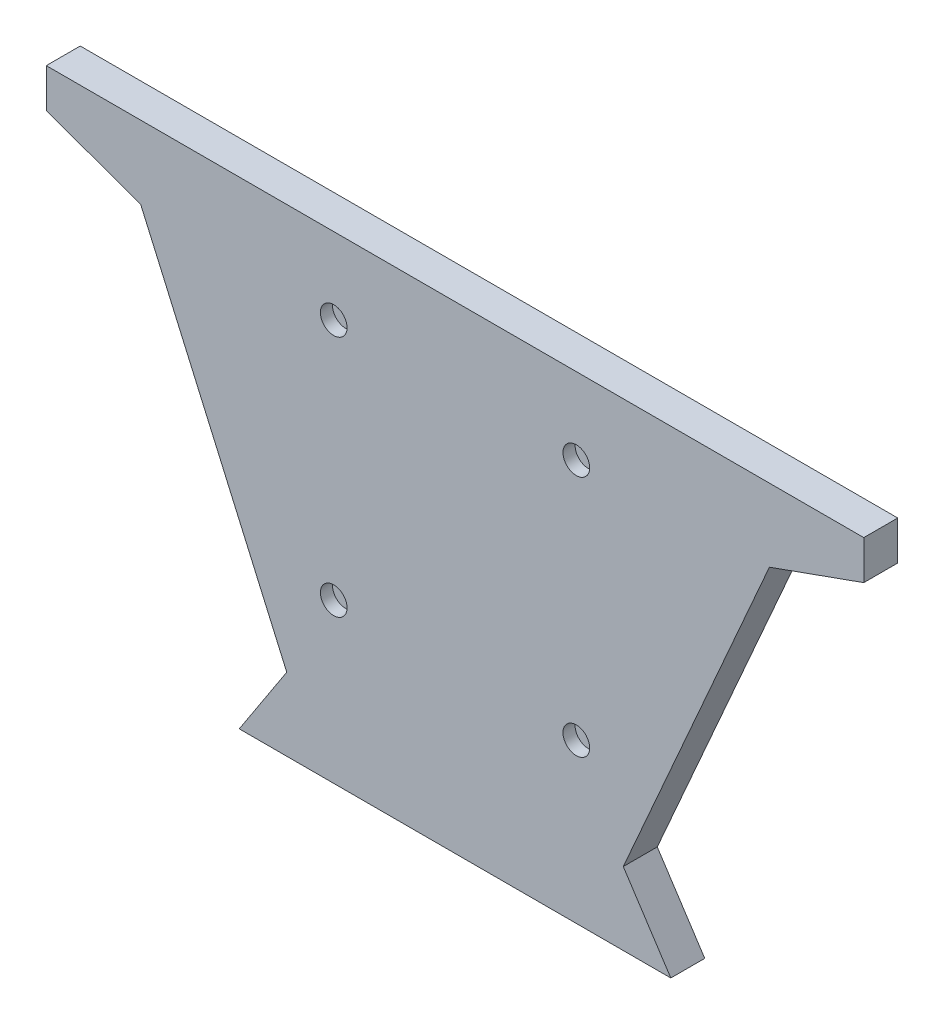
ISO-10303-21;
HEADER;
FILE_DESCRIPTION(('STEP AP214'),'2;1');
FILE_NAME('part.step','',(''),(''),'','','');
FILE_SCHEMA(('AUTOMOTIVE_DESIGN { 1 0 10303 214 1 1 1 1 }'));
ENDSEC;
DATA;
#1=APPLICATION_CONTEXT('core data for automotive mechanical design processes');
#2=APPLICATION_PROTOCOL_DEFINITION('international standard','automotive_design',2000,#1);
#3=PRODUCT_CONTEXT('',#1,'mechanical');
#4=PRODUCT('Part','Part','',(#3));
#5=PRODUCT_RELATED_PRODUCT_CATEGORY('part','',(#4));
#6=PRODUCT_DEFINITION_FORMATION('','',#4);
#7=PRODUCT_DEFINITION_CONTEXT('part definition',#1,'design');
#8=PRODUCT_DEFINITION('design','',#6,#7);
#9=PRODUCT_DEFINITION_SHAPE('','',#8);
#10=(LENGTH_UNIT() NAMED_UNIT(*) SI_UNIT(.MILLI.,.METRE.));
#11=(NAMED_UNIT(*) PLANE_ANGLE_UNIT() SI_UNIT($,.RADIAN.));
#12=(NAMED_UNIT(*) SI_UNIT($,.STERADIAN.) SOLID_ANGLE_UNIT());
#13=UNCERTAINTY_MEASURE_WITH_UNIT(LENGTH_MEASURE(1.E-05),#10,'distance_accuracy_value','');
#14=(GEOMETRIC_REPRESENTATION_CONTEXT(3) GLOBAL_UNCERTAINTY_ASSIGNED_CONTEXT((#13)) GLOBAL_UNIT_ASSIGNED_CONTEXT((#10,
#11,#12)) REPRESENTATION_CONTEXT('',''));
#15=CARTESIAN_POINT('',(0.,0.,0.));
#16=DIRECTION('',(0.,0.,1.));
#17=DIRECTION('',(1.,0.,0.));
#18=AXIS2_PLACEMENT_3D('',#15,#16,#17);
#19=CARTESIAN_POINT('',(0.,0.,7.));
#20=DIRECTION('',(0.,0.,1.));
#21=DIRECTION('',(1.,0.,0.));
#22=AXIS2_PLACEMENT_3D('',#19,#20,#21);
#23=PLANE('',#22);
#24=CARTESIAN_POINT('',(-24.9999999999995,-16.5530769247216,7.));
#25=DIRECTION('',(0.,0.,1.));
#26=DIRECTION('',(1.,0.,0.));
#27=AXIS2_PLACEMENT_3D('',#24,#25,#26);
#28=CIRCLE('',#27,2.75);
#29=CARTESIAN_POINT('',(-22.2499999999995,-16.5530769247216,7.));
#30=VERTEX_POINT('',#29);
#31=EDGE_CURVE('E271',#30,#30,#28,.T.);
#32=ORIENTED_EDGE('',*,*,#31,.F.);
#33=EDGE_LOOP('',(#32));
#34=FACE_BOUND('',#33,.T.);
#35=CARTESIAN_POINT('',(25.0000000000005,-16.5530769247213,7.));
#36=DIRECTION('',(0.,0.,1.));
#37=DIRECTION('',(1.,0.,0.));
#38=AXIS2_PLACEMENT_3D('',#35,#36,#37);
#39=CIRCLE('',#38,2.75);
#40=CARTESIAN_POINT('',(27.7500000000005,-16.5530769247213,7.));
#41=VERTEX_POINT('',#40);
#42=EDGE_CURVE('E280',#41,#41,#39,.T.);
#43=ORIENTED_EDGE('',*,*,#42,.F.);
#44=EDGE_LOOP('',(#43));
#45=FACE_BOUND('',#44,.T.);
#46=CARTESIAN_POINT('',(25.,33.4469230752787,7.));
#47=DIRECTION('',(0.,0.,1.));
#48=DIRECTION('',(1.,0.,0.));
#49=AXIS2_PLACEMENT_3D('',#46,#47,#48);
#50=CIRCLE('',#49,2.75);
#51=CARTESIAN_POINT('',(27.75,33.4469230752787,7.));
#52=VERTEX_POINT('',#51);
#53=EDGE_CURVE('E260',#52,#52,#50,.T.);
#54=ORIENTED_EDGE('',*,*,#53,.F.);
#55=EDGE_LOOP('',(#54));
#56=FACE_BOUND('',#55,.T.);
#57=CARTESIAN_POINT('',(-25.,33.4469230752784,7.));
#58=DIRECTION('',(0.,0.,1.));
#59=DIRECTION('',(1.,0.,0.));
#60=AXIS2_PLACEMENT_3D('',#57,#58,#59);
#61=CIRCLE('',#60,2.75);
#62=CARTESIAN_POINT('',(-22.25,33.4469230752784,7.));
#63=VERTEX_POINT('',#62);
#64=EDGE_CURVE('E254',#63,#63,#61,.T.);
#65=ORIENTED_EDGE('',*,*,#64,.F.);
#66=EDGE_LOOP('',(#65));
#67=FACE_BOUND('',#66,.T.);
#68=DIRECTION('',(0.402524691548119,-0.915409128583549,0.));
#69=VECTOR('',#68,1.);
#70=CARTESIAN_POINT('',(-41.6839180394226,-18.3292974992485,7.));
#71=LINE('',#70,#69);
#72=CARTESIAN_POINT('',(-64.8041435722949,34.25,7.));
#73=VERTEX_POINT('',#72);
#74=CARTESIAN_POINT('',(-34.6832495260328,-34.25,7.));
#75=VERTEX_POINT('',#74);
#76=EDGE_CURVE('E120',#73,#75,#71,.T.);
#77=ORIENTED_EDGE('',*,*,#76,.T.);
#78=DIRECTION('',(-0.54656898395897,-0.837414082622247,0.));
#79=VECTOR('',#78,1.);
#80=CARTESIAN_POINT('',(-8.64567559469956,5.64291695529728,7.));
#81=LINE('',#80,#79);
#82=CARTESIAN_POINT('',(-44.4735491275298,-49.25,7.));
#83=VERTEX_POINT('',#82);
#84=EDGE_CURVE('E113',#75,#83,#81,.T.);
#85=ORIENTED_EDGE('',*,*,#84,.T.);
#86=DIRECTION('',(1.,0.,0.));
#87=VECTOR('',#86,1.);
#88=CARTESIAN_POINT('',(-44.4735491275298,-49.25,7.));
#89=LINE('',#88,#87);
#90=CARTESIAN_POINT('',(44.4735491275299,-49.25,7.));
#91=VERTEX_POINT('',#90);
#92=EDGE_CURVE('E148',#83,#91,#89,.T.);
#93=ORIENTED_EDGE('',*,*,#92,.T.);
#94=DIRECTION('',(-0.54656898395897,0.837414082622247,0.));
#95=VECTOR('',#94,1.);
#96=CARTESIAN_POINT('',(8.64567559469958,5.64291695529731,7.));
#97=LINE('',#96,#95);
#98=CARTESIAN_POINT('',(34.6832495260329,-34.25,7.));
#99=VERTEX_POINT('',#98);
#100=EDGE_CURVE('E182',#91,#99,#97,.T.);
#101=ORIENTED_EDGE('',*,*,#100,.T.);
#102=DIRECTION('',(0.402524691548119,0.915409128583549,0.));
#103=VECTOR('',#102,1.);
#104=CARTESIAN_POINT('',(41.6839180394226,-18.3292974992485,7.));
#105=LINE('',#104,#103);
#106=CARTESIAN_POINT('',(64.804143572295,34.25,7.));
#107=VERTEX_POINT('',#106);
#108=EDGE_CURVE('E187',#99,#107,#105,.T.);
#109=ORIENTED_EDGE('',*,*,#108,.T.);
#110=DIRECTION('',(0.94153595264122,0.336912525567082,0.));
#111=VECTOR('',#110,1.);
#112=CARTESIAN_POINT('',(-3.50870093871182,9.805417816695,7.));
#113=LINE('',#112,#111);
#114=CARTESIAN_POINT('',(84.25,41.2083668924107,7.));
#115=VERTEX_POINT('',#114);
#116=EDGE_CURVE('E178',#107,#115,#113,.T.);
#117=ORIENTED_EDGE('',*,*,#116,.T.);
#118=DIRECTION('',(0.,1.,0.));
#119=VECTOR('',#118,1.);
#120=CARTESIAN_POINT('',(84.25,41.2083668924107,7.));
#121=LINE('',#120,#119);
#122=CARTESIAN_POINT('',(84.25,49.25,7.));
#123=VERTEX_POINT('',#122);
#124=EDGE_CURVE('E201',#115,#123,#121,.T.);
#125=ORIENTED_EDGE('',*,*,#124,.T.);
#126=DIRECTION('',(-1.,0.,0.));
#127=VECTOR('',#126,1.);
#128=CARTESIAN_POINT('',(84.25,49.25,7.));
#129=LINE('',#128,#127);
#130=CARTESIAN_POINT('',(-84.25,49.25,7.));
#131=VERTEX_POINT('',#130);
#132=EDGE_CURVE('E70',#123,#131,#129,.T.);
#133=ORIENTED_EDGE('',*,*,#132,.T.);
#134=DIRECTION('',(0.,-1.,0.));
#135=VECTOR('',#134,1.);
#136=CARTESIAN_POINT('',(-84.25,49.25,7.));
#137=LINE('',#136,#135);
#138=CARTESIAN_POINT('',(-84.25,41.2083668924108,7.));
#139=VERTEX_POINT('',#138);
#140=EDGE_CURVE('E96',#131,#139,#137,.T.);
#141=ORIENTED_EDGE('',*,*,#140,.T.);
#142=DIRECTION('',(0.94153595264122,-0.336912525567083,0.));
#143=VECTOR('',#142,1.);
#144=CARTESIAN_POINT('',(3.5087009387118,9.80541781669491,7.));
#145=LINE('',#144,#143);
#146=EDGE_CURVE('E191',#139,#73,#145,.T.);
#147=ORIENTED_EDGE('',*,*,#146,.T.);
#148=EDGE_LOOP('',(#77,#85,#93,#101,#109,#117,#125,#133,#141,#147));
#149=FACE_BOUND('',#148,.T.);
#150=ADVANCED_FACE('F45',(#34,#45,#56,#67,#149),#23,.T.);
#151=CARTESIAN_POINT('',(0.,0.,0.));
#152=DIRECTION('',(0.,0.,1.));
#153=DIRECTION('',(1.,0.,0.));
#154=AXIS2_PLACEMENT_3D('',#151,#152,#153);
#155=PLANE('',#154);
#156=CARTESIAN_POINT('',(-24.9999999999995,-16.5530769247216,0.));
#157=DIRECTION('',(0.,0.,1.));
#158=DIRECTION('',(1.,0.,0.));
#159=AXIS2_PLACEMENT_3D('',#156,#157,#158);
#160=CIRCLE('',#159,2.75);
#161=CARTESIAN_POINT('',(-22.2499999999995,-16.5530769247216,0.));
#162=VERTEX_POINT('',#161);
#163=EDGE_CURVE('E299',#162,#162,#160,.T.);
#164=ORIENTED_EDGE('',*,*,#163,.T.);
#165=EDGE_LOOP('',(#164));
#166=FACE_BOUND('',#165,.T.);
#167=CARTESIAN_POINT('',(25.0000000000005,-16.5530769247213,0.));
#168=DIRECTION('',(0.,0.,1.));
#169=DIRECTION('',(1.,0.,0.));
#170=AXIS2_PLACEMENT_3D('',#167,#168,#169);
#171=CIRCLE('',#170,2.75);
#172=CARTESIAN_POINT('',(27.7500000000005,-16.5530769247213,0.));
#173=VERTEX_POINT('',#172);
#174=EDGE_CURVE('E307',#173,#173,#171,.T.);
#175=ORIENTED_EDGE('',*,*,#174,.T.);
#176=EDGE_LOOP('',(#175));
#177=FACE_BOUND('',#176,.T.);
#178=CARTESIAN_POINT('',(25.,33.4469230752787,0.));
#179=DIRECTION('',(0.,0.,1.));
#180=DIRECTION('',(1.,0.,0.));
#181=AXIS2_PLACEMENT_3D('',#178,#179,#180);
#182=CIRCLE('',#181,2.75);
#183=CARTESIAN_POINT('',(27.75,33.4469230752787,0.));
#184=VERTEX_POINT('',#183);
#185=EDGE_CURVE('E315',#184,#184,#182,.T.);
#186=ORIENTED_EDGE('',*,*,#185,.T.);
#187=EDGE_LOOP('',(#186));
#188=FACE_BOUND('',#187,.T.);
#189=CARTESIAN_POINT('',(-25.,33.4469230752784,0.));
#190=DIRECTION('',(0.,0.,1.));
#191=DIRECTION('',(1.,0.,0.));
#192=AXIS2_PLACEMENT_3D('',#189,#190,#191);
#193=CIRCLE('',#192,2.75);
#194=CARTESIAN_POINT('',(-22.25,33.4469230752784,0.));
#195=VERTEX_POINT('',#194);
#196=EDGE_CURVE('E291',#195,#195,#193,.T.);
#197=ORIENTED_EDGE('',*,*,#196,.T.);
#198=EDGE_LOOP('',(#197));
#199=FACE_BOUND('',#198,.T.);
#200=DIRECTION('',(0.54656898395897,0.837414082622247,0.));
#201=VECTOR('',#200,1.);
#202=CARTESIAN_POINT('',(-8.64567559469956,5.64291695529728,0.));
#203=LINE('',#202,#201);
#204=CARTESIAN_POINT('',(-44.4735491275298,-49.25,0.));
#205=VERTEX_POINT('',#204);
#206=CARTESIAN_POINT('',(-34.6832495260328,-34.25,0.));
#207=VERTEX_POINT('',#206);
#208=EDGE_CURVE('E157',#205,#207,#203,.T.);
#209=ORIENTED_EDGE('',*,*,#208,.T.);
#210=DIRECTION('',(-0.402524691548119,0.915409128583548,0.));
#211=VECTOR('',#210,1.);
#212=CARTESIAN_POINT('',(-41.6839180394226,-18.3292974992485,0.));
#213=LINE('',#212,#211);
#214=CARTESIAN_POINT('',(-64.8041435722949,34.25,0.));
#215=VERTEX_POINT('',#214);
#216=EDGE_CURVE('E240',#207,#215,#213,.T.);
#217=ORIENTED_EDGE('',*,*,#216,.T.);
#218=DIRECTION('',(-0.94153595264122,0.336912525567083,0.));
#219=VECTOR('',#218,1.);
#220=CARTESIAN_POINT('',(3.5087009387118,9.80541781669491,0.));
#221=LINE('',#220,#219);
#222=CARTESIAN_POINT('',(-84.25,41.2083668924108,0.));
#223=VERTEX_POINT('',#222);
#224=EDGE_CURVE('E110',#215,#223,#221,.T.);
#225=ORIENTED_EDGE('',*,*,#224,.T.);
#226=DIRECTION('',(0.,-1.,0.));
#227=VECTOR('',#226,1.);
#228=CARTESIAN_POINT('',(-84.25,49.25,0.));
#229=LINE('',#228,#227);
#230=CARTESIAN_POINT('',(-84.25,49.25,0.));
#231=VERTEX_POINT('',#230);
#232=EDGE_CURVE('E102',#231,#223,#229,.T.);
#233=ORIENTED_EDGE('',*,*,#232,.F.);
#234=DIRECTION('',(-1.,0.,0.));
#235=VECTOR('',#234,1.);
#236=CARTESIAN_POINT('',(84.25,49.25,0.));
#237=LINE('',#236,#235);
#238=CARTESIAN_POINT('',(84.25,49.25,0.));
#239=VERTEX_POINT('',#238);
#240=EDGE_CURVE('E85',#239,#231,#237,.T.);
#241=ORIENTED_EDGE('',*,*,#240,.F.);
#242=DIRECTION('',(0.,1.,0.));
#243=VECTOR('',#242,1.);
#244=CARTESIAN_POINT('',(84.25,41.2083668924107,0.));
#245=LINE('',#244,#243);
#246=CARTESIAN_POINT('',(84.25,41.2083668924107,0.));
#247=VERTEX_POINT('',#246);
#248=EDGE_CURVE('E97',#247,#239,#245,.T.);
#249=ORIENTED_EDGE('',*,*,#248,.F.);
#250=DIRECTION('',(-0.94153595264122,-0.336912525567082,0.));
#251=VECTOR('',#250,1.);
#252=CARTESIAN_POINT('',(-3.50870093871182,9.805417816695,0.));
#253=LINE('',#252,#251);
#254=CARTESIAN_POINT('',(64.804143572295,34.25,0.));
#255=VERTEX_POINT('',#254);
#256=EDGE_CURVE('E167',#247,#255,#253,.T.);
#257=ORIENTED_EDGE('',*,*,#256,.T.);
#258=DIRECTION('',(-0.402524691548119,-0.915409128583549,0.));
#259=VECTOR('',#258,1.);
#260=CARTESIAN_POINT('',(41.6839180394226,-18.3292974992485,0.));
#261=LINE('',#260,#259);
#262=CARTESIAN_POINT('',(34.6832495260329,-34.25,0.));
#263=VERTEX_POINT('',#262);
#264=EDGE_CURVE('E61',#255,#263,#261,.T.);
#265=ORIENTED_EDGE('',*,*,#264,.T.);
#266=DIRECTION('',(0.54656898395897,-0.837414082622247,0.));
#267=VECTOR('',#266,1.);
#268=CARTESIAN_POINT('',(8.64567559469958,5.64291695529731,0.));
#269=LINE('',#268,#267);
#270=CARTESIAN_POINT('',(44.4735491275299,-49.25,0.));
#271=VERTEX_POINT('',#270);
#272=EDGE_CURVE('E159',#263,#271,#269,.T.);
#273=ORIENTED_EDGE('',*,*,#272,.T.);
#274=DIRECTION('',(1.,0.,0.));
#275=VECTOR('',#274,1.);
#276=CARTESIAN_POINT('',(-44.4735491275298,-49.25,0.));
#277=LINE('',#276,#275);
#278=EDGE_CURVE('E112',#205,#271,#277,.T.);
#279=ORIENTED_EDGE('',*,*,#278,.F.);
#280=EDGE_LOOP('',(#209,#217,#225,#233,#241,#249,#257,#265,#273,#279));
#281=FACE_BOUND('',#280,.T.);
#282=ADVANCED_FACE('F107',(#166,#177,#188,#199,#281),#155,.F.);
#283=CARTESIAN_POINT('',(-84.25,49.25,7.));
#284=DIRECTION('',(1.,0.,0.));
#285=DIRECTION('',(0.,0.,-1.));
#286=AXIS2_PLACEMENT_3D('',#283,#284,#285);
#287=PLANE('',#286);
#288=ORIENTED_EDGE('',*,*,#232,.T.);
#289=DIRECTION('',(0.,0.,-1.));
#290=VECTOR('',#289,1.);
#291=CARTESIAN_POINT('',(-84.25,41.2083668924108,7.));
#292=LINE('',#291,#290);
#293=EDGE_CURVE('E11',#139,#223,#292,.T.);
#294=ORIENTED_EDGE('',*,*,#293,.F.);
#295=ORIENTED_EDGE('',*,*,#140,.F.);
#296=DIRECTION('',(0.,0.,-1.));
#297=VECTOR('',#296,1.);
#298=CARTESIAN_POINT('',(-84.25,49.25,7.));
#299=LINE('',#298,#297);
#300=EDGE_CURVE('E88',#131,#231,#299,.T.);
#301=ORIENTED_EDGE('',*,*,#300,.T.);
#302=EDGE_LOOP('',(#288,#294,#295,#301));
#303=FACE_BOUND('',#302,.T.);
#304=ADVANCED_FACE('F47',(#303),#287,.F.);
#305=CARTESIAN_POINT('',(-44.4735491275298,-49.25,7.));
#306=DIRECTION('',(0.,1.,0.));
#307=DIRECTION('',(0.,0.,1.));
#308=AXIS2_PLACEMENT_3D('',#305,#306,#307);
#309=PLANE('',#308);
#310=ORIENTED_EDGE('',*,*,#278,.T.);
#311=DIRECTION('',(0.,0.,-1.));
#312=VECTOR('',#311,1.);
#313=CARTESIAN_POINT('',(44.4735491275299,-49.25,7.));
#314=LINE('',#313,#312);
#315=EDGE_CURVE('E133',#91,#271,#314,.T.);
#316=ORIENTED_EDGE('',*,*,#315,.F.);
#317=ORIENTED_EDGE('',*,*,#92,.F.);
#318=DIRECTION('',(0.,0.,-1.));
#319=VECTOR('',#318,1.);
#320=CARTESIAN_POINT('',(-44.4735491275298,-49.25,7.));
#321=LINE('',#320,#319);
#322=EDGE_CURVE('E54',#83,#205,#321,.T.);
#323=ORIENTED_EDGE('',*,*,#322,.T.);
#324=EDGE_LOOP('',(#310,#316,#317,#323));
#325=FACE_BOUND('',#324,.T.);
#326=ADVANCED_FACE('F143',(#325),#309,.F.);
#327=CARTESIAN_POINT('',(84.25,41.2083668924107,7.));
#328=DIRECTION('',(-1.,0.,0.));
#329=DIRECTION('',(0.,0.,1.));
#330=AXIS2_PLACEMENT_3D('',#327,#328,#329);
#331=PLANE('',#330);
#332=ORIENTED_EDGE('',*,*,#248,.T.);
#333=DIRECTION('',(0.,0.,-1.));
#334=VECTOR('',#333,1.);
#335=CARTESIAN_POINT('',(84.25,49.25,7.));
#336=LINE('',#335,#334);
#337=EDGE_CURVE('E91',#123,#239,#336,.T.);
#338=ORIENTED_EDGE('',*,*,#337,.F.);
#339=ORIENTED_EDGE('',*,*,#124,.F.);
#340=DIRECTION('',(0.,0.,-1.));
#341=VECTOR('',#340,1.);
#342=CARTESIAN_POINT('',(84.25,41.2083668924107,7.));
#343=LINE('',#342,#341);
#344=EDGE_CURVE('E129',#115,#247,#343,.T.);
#345=ORIENTED_EDGE('',*,*,#344,.T.);
#346=EDGE_LOOP('',(#332,#338,#339,#345));
#347=FACE_BOUND('',#346,.T.);
#348=ADVANCED_FACE('F208',(#347),#331,.F.);
#349=CARTESIAN_POINT('',(84.25,49.25,7.));
#350=DIRECTION('',(0.,-1.,0.));
#351=DIRECTION('',(1.,0.,0.));
#352=AXIS2_PLACEMENT_3D('',#349,#350,#351);
#353=PLANE('',#352);
#354=ORIENTED_EDGE('',*,*,#240,.T.);
#355=ORIENTED_EDGE('',*,*,#300,.F.);
#356=ORIENTED_EDGE('',*,*,#132,.F.);
#357=ORIENTED_EDGE('',*,*,#337,.T.);
#358=EDGE_LOOP('',(#354,#355,#356,#357));
#359=FACE_BOUND('',#358,.T.);
#360=ADVANCED_FACE('F87',(#359),#353,.F.);
#361=CARTESIAN_POINT('',(41.6839180394226,-18.3292974992485,10.));
#362=DIRECTION('',(0.915409128583549,-0.402524691548119,0.));
#363=DIRECTION('',(0.402524691548119,0.915409128583549,0.));
#364=AXIS2_PLACEMENT_3D('',#361,#362,#363);
#365=PLANE('',#364);
#366=DIRECTION('',(0.,0.,-1.));
#367=VECTOR('',#366,1.);
#368=CARTESIAN_POINT('',(34.6832495260329,-34.25,10.));
#369=LINE('',#368,#367);
#370=EDGE_CURVE('E171',#99,#263,#369,.T.);
#371=ORIENTED_EDGE('',*,*,#370,.T.);
#372=ORIENTED_EDGE('',*,*,#264,.F.);
#373=DIRECTION('',(0.,0.,-1.));
#374=VECTOR('',#373,1.);
#375=CARTESIAN_POINT('',(64.804143572295,34.25,10.));
#376=LINE('',#375,#374);
#377=EDGE_CURVE('E166',#107,#255,#376,.T.);
#378=ORIENTED_EDGE('',*,*,#377,.F.);
#379=ORIENTED_EDGE('',*,*,#108,.F.);
#380=EDGE_LOOP('',(#371,#372,#378,#379));
#381=FACE_BOUND('',#380,.T.);
#382=ADVANCED_FACE('F352',(#381),#365,.T.);
#383=CARTESIAN_POINT('',(8.64567559469958,5.64291695529731,10.));
#384=DIRECTION('',(0.837414082622247,0.54656898395897,0.));
#385=DIRECTION('',(-0.54656898395897,0.837414082622247,0.));
#386=AXIS2_PLACEMENT_3D('',#383,#384,#385);
#387=PLANE('',#386);
#388=ORIENTED_EDGE('',*,*,#315,.T.);
#389=ORIENTED_EDGE('',*,*,#272,.F.);
#390=ORIENTED_EDGE('',*,*,#370,.F.);
#391=ORIENTED_EDGE('',*,*,#100,.F.);
#392=EDGE_LOOP('',(#388,#389,#390,#391));
#393=FACE_BOUND('',#392,.T.);
#394=ADVANCED_FACE('F395',(#393),#387,.T.);
#395=CARTESIAN_POINT('',(-3.50870093871182,9.805417816695,10.));
#396=DIRECTION('',(0.336912525567082,-0.94153595264122,0.));
#397=DIRECTION('',(0.94153595264122,0.336912525567082,0.));
#398=AXIS2_PLACEMENT_3D('',#395,#396,#397);
#399=PLANE('',#398);
#400=ORIENTED_EDGE('',*,*,#377,.T.);
#401=ORIENTED_EDGE('',*,*,#256,.F.);
#402=ORIENTED_EDGE('',*,*,#344,.F.);
#403=ORIENTED_EDGE('',*,*,#116,.F.);
#404=EDGE_LOOP('',(#400,#401,#402,#403));
#405=FACE_BOUND('',#404,.T.);
#406=ADVANCED_FACE('F403',(#405),#399,.T.);
#407=CARTESIAN_POINT('',(-8.64567559469956,5.64291695529728,10.));
#408=DIRECTION('',(-0.837414082622247,0.54656898395897,0.));
#409=DIRECTION('',(-0.54656898395897,-0.837414082622247,0.));
#410=AXIS2_PLACEMENT_3D('',#407,#408,#409);
#411=PLANE('',#410);
#412=DIRECTION('',(0.,0.,-1.));
#413=VECTOR('',#412,1.);
#414=CARTESIAN_POINT('',(-34.6832495260328,-34.25,10.));
#415=LINE('',#414,#413);
#416=EDGE_CURVE('E183',#75,#207,#415,.T.);
#417=ORIENTED_EDGE('',*,*,#416,.T.);
#418=ORIENTED_EDGE('',*,*,#208,.F.);
#419=ORIENTED_EDGE('',*,*,#322,.F.);
#420=ORIENTED_EDGE('',*,*,#84,.F.);
#421=EDGE_LOOP('',(#417,#418,#419,#420));
#422=FACE_BOUND('',#421,.T.);
#423=ADVANCED_FACE('F234',(#422),#411,.T.);
#424=CARTESIAN_POINT('',(-41.6839180394226,-18.3292974992485,10.));
#425=DIRECTION('',(-0.915409128583548,-0.402524691548119,0.));
#426=DIRECTION('',(0.402524691548119,-0.915409128583549,0.));
#427=AXIS2_PLACEMENT_3D('',#424,#425,#426);
#428=PLANE('',#427);
#429=DIRECTION('',(0.,0.,-1.));
#430=VECTOR('',#429,1.);
#431=CARTESIAN_POINT('',(-64.8041435722949,34.25,10.));
#432=LINE('',#431,#430);
#433=EDGE_CURVE('E242',#73,#215,#432,.T.);
#434=ORIENTED_EDGE('',*,*,#433,.T.);
#435=ORIENTED_EDGE('',*,*,#216,.F.);
#436=ORIENTED_EDGE('',*,*,#416,.F.);
#437=ORIENTED_EDGE('',*,*,#76,.F.);
#438=EDGE_LOOP('',(#434,#435,#436,#437));
#439=FACE_BOUND('',#438,.T.);
#440=ADVANCED_FACE('F238',(#439),#428,.T.);
#441=CARTESIAN_POINT('',(3.5087009387118,9.80541781669491,10.));
#442=DIRECTION('',(-0.336912525567083,-0.94153595264122,0.));
#443=DIRECTION('',(0.94153595264122,-0.336912525567083,0.));
#444=AXIS2_PLACEMENT_3D('',#441,#442,#443);
#445=PLANE('',#444);
#446=ORIENTED_EDGE('',*,*,#293,.T.);
#447=ORIENTED_EDGE('',*,*,#224,.F.);
#448=ORIENTED_EDGE('',*,*,#433,.F.);
#449=ORIENTED_EDGE('',*,*,#146,.F.);
#450=EDGE_LOOP('',(#446,#447,#448,#449));
#451=FACE_BOUND('',#450,.T.);
#452=ADVANCED_FACE('F245',(#451),#445,.T.);
#453=CARTESIAN_POINT('',(-25.,33.4469230752784,4.5));
#454=DIRECTION('',(0.,0.,1.));
#455=DIRECTION('',(1.,0.,0.));
#456=AXIS2_PLACEMENT_3D('',#453,#454,#455);
#457=CYLINDRICAL_SURFACE('',#456,2.75);
#458=CARTESIAN_POINT('',(-25.,33.4469230752784,4.5));
#459=DIRECTION('',(0.,0.,1.));
#460=DIRECTION('',(1.,0.,0.));
#461=AXIS2_PLACEMENT_3D('',#458,#459,#460);
#462=CIRCLE('',#461,2.75);
#463=CARTESIAN_POINT('',(-22.25,33.4469230752784,4.5));
#464=VERTEX_POINT('',#463);
#465=EDGE_CURVE('E251',#464,#464,#462,.T.);
#466=ORIENTED_EDGE('',*,*,#465,.F.);
#467=EDGE_LOOP('',(#466));
#468=FACE_BOUND('',#467,.T.);
#469=ORIENTED_EDGE('',*,*,#64,.T.);
#470=EDGE_LOOP('',(#469));
#471=FACE_BOUND('',#470,.T.);
#472=ADVANCED_FACE('F434',(#468,#471),#457,.F.);
#473=CARTESIAN_POINT('',(-25.,33.4469230752784,4.5));
#474=DIRECTION('',(0.,0.,1.));
#475=DIRECTION('',(1.,0.,0.));
#476=AXIS2_PLACEMENT_3D('',#473,#474,#475);
#477=PLANE('',#476);
#478=ORIENTED_EDGE('',*,*,#465,.T.);
#479=EDGE_LOOP('',(#478));
#480=FACE_BOUND('',#479,.T.);
#481=ADVANCED_FACE('F442',(#480),#477,.T.);
#482=CARTESIAN_POINT('',(25.,33.4469230752787,4.5));
#483=DIRECTION('',(0.,0.,1.));
#484=DIRECTION('',(1.,0.,0.));
#485=AXIS2_PLACEMENT_3D('',#482,#483,#484);
#486=CYLINDRICAL_SURFACE('',#485,2.75);
#487=CARTESIAN_POINT('',(25.,33.4469230752787,4.5));
#488=DIRECTION('',(0.,0.,1.));
#489=DIRECTION('',(1.,0.,0.));
#490=AXIS2_PLACEMENT_3D('',#487,#488,#489);
#491=CIRCLE('',#490,2.75);
#492=CARTESIAN_POINT('',(27.75,33.4469230752787,4.5));
#493=VERTEX_POINT('',#492);
#494=EDGE_CURVE('E284',#493,#493,#491,.T.);
#495=ORIENTED_EDGE('',*,*,#494,.F.);
#496=EDGE_LOOP('',(#495));
#497=FACE_BOUND('',#496,.T.);
#498=ORIENTED_EDGE('',*,*,#53,.T.);
#499=EDGE_LOOP('',(#498));
#500=FACE_BOUND('',#499,.T.);
#501=ADVANCED_FACE('F452',(#497,#500),#486,.F.);
#502=CARTESIAN_POINT('',(25.,33.4469230752787,4.5));
#503=DIRECTION('',(0.,0.,1.));
#504=DIRECTION('',(1.,0.,0.));
#505=AXIS2_PLACEMENT_3D('',#502,#503,#504);
#506=PLANE('',#505);
#507=ORIENTED_EDGE('',*,*,#494,.T.);
#508=EDGE_LOOP('',(#507));
#509=FACE_BOUND('',#508,.T.);
#510=ADVANCED_FACE('F461',(#509),#506,.T.);
#511=CARTESIAN_POINT('',(25.0000000000005,-16.5530769247213,4.5));
#512=DIRECTION('',(0.,0.,1.));
#513=DIRECTION('',(1.,0.,0.));
#514=AXIS2_PLACEMENT_3D('',#511,#512,#513);
#515=CYLINDRICAL_SURFACE('',#514,2.75);
#516=CARTESIAN_POINT('',(25.0000000000005,-16.5530769247213,4.5));
#517=DIRECTION('',(0.,0.,1.));
#518=DIRECTION('',(1.,0.,0.));
#519=AXIS2_PLACEMENT_3D('',#516,#517,#518);
#520=CIRCLE('',#519,2.75);
#521=CARTESIAN_POINT('',(27.7500000000005,-16.5530769247213,4.5));
#522=VERTEX_POINT('',#521);
#523=EDGE_CURVE('E276',#522,#522,#520,.T.);
#524=ORIENTED_EDGE('',*,*,#523,.F.);
#525=EDGE_LOOP('',(#524));
#526=FACE_BOUND('',#525,.T.);
#527=ORIENTED_EDGE('',*,*,#42,.T.);
#528=EDGE_LOOP('',(#527));
#529=FACE_BOUND('',#528,.T.);
#530=ADVANCED_FACE('F471',(#526,#529),#515,.F.);
#531=CARTESIAN_POINT('',(25.0000000000005,-16.5530769247213,4.5));
#532=DIRECTION('',(0.,0.,1.));
#533=DIRECTION('',(1.,0.,0.));
#534=AXIS2_PLACEMENT_3D('',#531,#532,#533);
#535=PLANE('',#534);
#536=ORIENTED_EDGE('',*,*,#523,.T.);
#537=EDGE_LOOP('',(#536));
#538=FACE_BOUND('',#537,.T.);
#539=ADVANCED_FACE('F481',(#538),#535,.T.);
#540=CARTESIAN_POINT('',(-24.9999999999995,-16.5530769247216,4.5));
#541=DIRECTION('',(0.,0.,1.));
#542=DIRECTION('',(1.,0.,0.));
#543=AXIS2_PLACEMENT_3D('',#540,#541,#542);
#544=CYLINDRICAL_SURFACE('',#543,2.75);
#545=CARTESIAN_POINT('',(-24.9999999999995,-16.5530769247216,4.5));
#546=DIRECTION('',(0.,0.,1.));
#547=DIRECTION('',(1.,0.,0.));
#548=AXIS2_PLACEMENT_3D('',#545,#546,#547);
#549=CIRCLE('',#548,2.75);
#550=CARTESIAN_POINT('',(-22.2499999999995,-16.5530769247216,4.5));
#551=VERTEX_POINT('',#550);
#552=EDGE_CURVE('E263',#551,#551,#549,.T.);
#553=ORIENTED_EDGE('',*,*,#552,.F.);
#554=EDGE_LOOP('',(#553));
#555=FACE_BOUND('',#554,.T.);
#556=ORIENTED_EDGE('',*,*,#31,.T.);
#557=EDGE_LOOP('',(#556));
#558=FACE_BOUND('',#557,.T.);
#559=ADVANCED_FACE('F491',(#555,#558),#544,.F.);
#560=CARTESIAN_POINT('',(-24.9999999999995,-16.5530769247216,4.5));
#561=DIRECTION('',(0.,0.,1.));
#562=DIRECTION('',(1.,0.,0.));
#563=AXIS2_PLACEMENT_3D('',#560,#561,#562);
#564=PLANE('',#563);
#565=ORIENTED_EDGE('',*,*,#552,.T.);
#566=EDGE_LOOP('',(#565));
#567=FACE_BOUND('',#566,.T.);
#568=ADVANCED_FACE('F501',(#567),#564,.T.);
#569=CARTESIAN_POINT('',(-25.,33.4469230752784,2.5));
#570=DIRECTION('',(0.,0.,-1.));
#571=DIRECTION('',(-1.,0.,0.));
#572=AXIS2_PLACEMENT_3D('',#569,#570,#571);
#573=CYLINDRICAL_SURFACE('',#572,2.75);
#574=CARTESIAN_POINT('',(-25.,33.4469230752784,2.5));
#575=DIRECTION('',(0.,0.,1.));
#576=DIRECTION('',(1.,0.,0.));
#577=AXIS2_PLACEMENT_3D('',#574,#575,#576);
#578=CIRCLE('',#577,2.75);
#579=CARTESIAN_POINT('',(-22.25,33.4469230752784,2.5));
#580=VERTEX_POINT('',#579);
#581=EDGE_CURVE('E272',#580,#580,#578,.T.);
#582=ORIENTED_EDGE('',*,*,#581,.T.);
#583=EDGE_LOOP('',(#582));
#584=FACE_BOUND('',#583,.T.);
#585=ORIENTED_EDGE('',*,*,#196,.F.);
#586=EDGE_LOOP('',(#585));
#587=FACE_BOUND('',#586,.T.);
#588=ADVANCED_FACE('F510',(#584,#587),#573,.F.);
#589=CARTESIAN_POINT('',(-25.,33.4469230752784,2.5));
#590=DIRECTION('',(0.,0.,-1.));
#591=DIRECTION('',(1.,0.,0.));
#592=AXIS2_PLACEMENT_3D('',#589,#590,#591);
#593=PLANE('',#592);
#594=ORIENTED_EDGE('',*,*,#581,.F.);
#595=EDGE_LOOP('',(#594));
#596=FACE_BOUND('',#595,.T.);
#597=ADVANCED_FACE('F337',(#596),#593,.T.);
#598=CARTESIAN_POINT('',(25.,33.4469230752787,2.5));
#599=DIRECTION('',(0.,0.,-1.));
#600=DIRECTION('',(-1.,0.,0.));
#601=AXIS2_PLACEMENT_3D('',#598,#599,#600);
#602=CYLINDRICAL_SURFACE('',#601,2.75);
#603=CARTESIAN_POINT('',(25.,33.4469230752787,2.5));
#604=DIRECTION('',(0.,0.,1.));
#605=DIRECTION('',(1.,0.,0.));
#606=AXIS2_PLACEMENT_3D('',#603,#604,#605);
#607=CIRCLE('',#606,2.75);
#608=CARTESIAN_POINT('',(27.75,33.4469230752787,2.5));
#609=VERTEX_POINT('',#608);
#610=EDGE_CURVE('E295',#609,#609,#607,.T.);
#611=ORIENTED_EDGE('',*,*,#610,.T.);
#612=EDGE_LOOP('',(#611));
#613=FACE_BOUND('',#612,.T.);
#614=ORIENTED_EDGE('',*,*,#185,.F.);
#615=EDGE_LOOP('',(#614));
#616=FACE_BOUND('',#615,.T.);
#617=ADVANCED_FACE('F323',(#613,#616),#602,.F.);
#618=CARTESIAN_POINT('',(25.,33.4469230752787,2.5));
#619=DIRECTION('',(0.,0.,-1.));
#620=DIRECTION('',(1.,0.,0.));
#621=AXIS2_PLACEMENT_3D('',#618,#619,#620);
#622=PLANE('',#621);
#623=ORIENTED_EDGE('',*,*,#610,.F.);
#624=EDGE_LOOP('',(#623));
#625=FACE_BOUND('',#624,.T.);
#626=ADVANCED_FACE('F326',(#625),#622,.T.);
#627=CARTESIAN_POINT('',(25.0000000000005,-16.5530769247213,2.5));
#628=DIRECTION('',(0.,0.,-1.));
#629=DIRECTION('',(-1.,0.,0.));
#630=AXIS2_PLACEMENT_3D('',#627,#628,#629);
#631=CYLINDRICAL_SURFACE('',#630,2.75);
#632=CARTESIAN_POINT('',(25.0000000000005,-16.5530769247213,2.5));
#633=DIRECTION('',(0.,0.,1.));
#634=DIRECTION('',(1.,0.,0.));
#635=AXIS2_PLACEMENT_3D('',#632,#633,#634);
#636=CIRCLE('',#635,2.75);
#637=CARTESIAN_POINT('',(27.7500000000005,-16.5530769247213,2.5));
#638=VERTEX_POINT('',#637);
#639=EDGE_CURVE('E311',#638,#638,#636,.T.);
#640=ORIENTED_EDGE('',*,*,#639,.T.);
#641=EDGE_LOOP('',(#640));
#642=FACE_BOUND('',#641,.T.);
#643=ORIENTED_EDGE('',*,*,#174,.F.);
#644=EDGE_LOOP('',(#643));
#645=FACE_BOUND('',#644,.T.);
#646=ADVANCED_FACE('F328',(#642,#645),#631,.F.);
#647=CARTESIAN_POINT('',(25.0000000000005,-16.5530769247213,2.5));
#648=DIRECTION('',(0.,0.,-1.));
#649=DIRECTION('',(1.,0.,0.));
#650=AXIS2_PLACEMENT_3D('',#647,#648,#649);
#651=PLANE('',#650);
#652=ORIENTED_EDGE('',*,*,#639,.F.);
#653=EDGE_LOOP('',(#652));
#654=FACE_BOUND('',#653,.T.);
#655=ADVANCED_FACE('F334',(#654),#651,.T.);
#656=CARTESIAN_POINT('',(-24.9999999999995,-16.5530769247216,2.5));
#657=DIRECTION('',(0.,0.,-1.));
#658=DIRECTION('',(-1.,0.,0.));
#659=AXIS2_PLACEMENT_3D('',#656,#657,#658);
#660=CYLINDRICAL_SURFACE('',#659,2.75);
#661=CARTESIAN_POINT('',(-24.9999999999995,-16.5530769247216,2.5));
#662=DIRECTION('',(0.,0.,1.));
#663=DIRECTION('',(1.,0.,0.));
#664=AXIS2_PLACEMENT_3D('',#661,#662,#663);
#665=CIRCLE('',#664,2.75);
#666=CARTESIAN_POINT('',(-22.2499999999995,-16.5530769247216,2.5));
#667=VERTEX_POINT('',#666);
#668=EDGE_CURVE('E303',#667,#667,#665,.T.);
#669=ORIENTED_EDGE('',*,*,#668,.T.);
#670=EDGE_LOOP('',(#669));
#671=FACE_BOUND('',#670,.T.);
#672=ORIENTED_EDGE('',*,*,#163,.F.);
#673=EDGE_LOOP('',(#672));
#674=FACE_BOUND('',#673,.T.);
#675=ADVANCED_FACE('F553',(#671,#674),#660,.F.);
#676=CARTESIAN_POINT('',(-24.9999999999995,-16.5530769247216,2.5));
#677=DIRECTION('',(0.,0.,-1.));
#678=DIRECTION('',(1.,0.,0.));
#679=AXIS2_PLACEMENT_3D('',#676,#677,#678);
#680=PLANE('',#679);
#681=ORIENTED_EDGE('',*,*,#668,.F.);
#682=EDGE_LOOP('',(#681));
#683=FACE_BOUND('',#682,.T.);
#684=ADVANCED_FACE('F563',(#683),#680,.T.);
#685=CLOSED_SHELL('',(#150,#282,#304,#326,#348,#360,#382,#394,#406,#423,#440,#452,#472,#481,
#501,#510,#530,#539,#559,#568,#588,#597,#617,#626,#646,#655,#675,#684));
#686=MANIFOLD_SOLID_BREP('B2',#685);
#687=ADVANCED_BREP_SHAPE_REPRESENTATION('',(#18,#686),#14);
#688=SHAPE_DEFINITION_REPRESENTATION(#9,#687);
ENDSEC;
END-ISO-10303-21;
